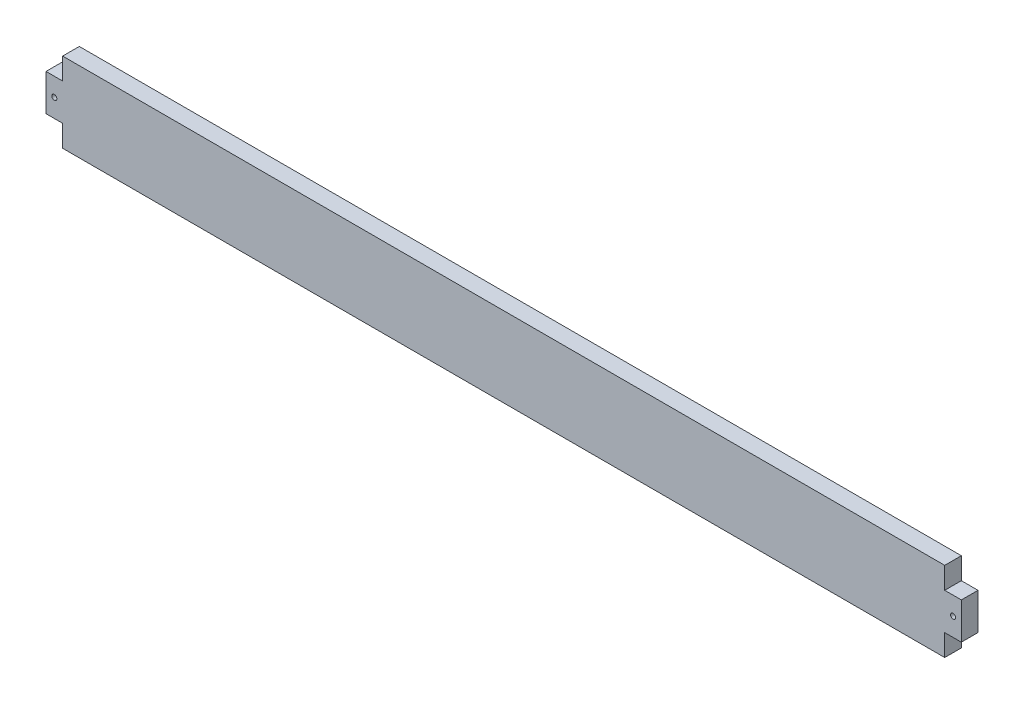
ISO-10303-21;
HEADER;
FILE_DESCRIPTION(('STEP AP214'),'2;1');
FILE_NAME('part.step','',(''),(''),'','','');
FILE_SCHEMA(('AUTOMOTIVE_DESIGN { 1 0 10303 214 1 1 1 1 }'));
ENDSEC;
DATA;
#1=APPLICATION_CONTEXT('core data for automotive mechanical design processes');
#2=APPLICATION_PROTOCOL_DEFINITION('international standard','automotive_design',2000,#1);
#3=PRODUCT_CONTEXT('',#1,'mechanical');
#4=PRODUCT('Part','Part','',(#3));
#5=PRODUCT_RELATED_PRODUCT_CATEGORY('part','',(#4));
#6=PRODUCT_DEFINITION_FORMATION('','',#4);
#7=PRODUCT_DEFINITION_CONTEXT('part definition',#1,'design');
#8=PRODUCT_DEFINITION('design','',#6,#7);
#9=PRODUCT_DEFINITION_SHAPE('','',#8);
#10=(LENGTH_UNIT() NAMED_UNIT(*) SI_UNIT(.MILLI.,.METRE.));
#11=(NAMED_UNIT(*) PLANE_ANGLE_UNIT() SI_UNIT($,.RADIAN.));
#12=(NAMED_UNIT(*) SI_UNIT($,.STERADIAN.) SOLID_ANGLE_UNIT());
#13=UNCERTAINTY_MEASURE_WITH_UNIT(LENGTH_MEASURE(1.E-05),#10,'distance_accuracy_value','');
#14=(GEOMETRIC_REPRESENTATION_CONTEXT(3) GLOBAL_UNCERTAINTY_ASSIGNED_CONTEXT((#13)) GLOBAL_UNIT_ASSIGNED_CONTEXT((#10,
#11,#12)) REPRESENTATION_CONTEXT('',''));
#15=CARTESIAN_POINT('',(0.,0.,0.));
#16=DIRECTION('',(0.,0.,1.));
#17=DIRECTION('',(1.,0.,0.));
#18=AXIS2_PLACEMENT_3D('',#15,#16,#17);
#19=CARTESIAN_POINT('',(275.,24.,10.));
#20=DIRECTION('',(-1.,0.,0.));
#21=DIRECTION('',(0.,-1.,0.));
#22=AXIS2_PLACEMENT_3D('',#19,#20,#21);
#23=PLANE('',#22);
#24=DIRECTION('',(0.,0.,1.));
#25=VECTOR('',#24,1.);
#26=CARTESIAN_POINT('',(275.,-11.,-0.000999999999999265));
#27=LINE('',#26,#25);
#28=CARTESIAN_POINT('',(275.,-11.,0.));
#29=VERTEX_POINT('',#28);
#30=CARTESIAN_POINT('',(275.,-11.,10.));
#31=VERTEX_POINT('',#30);
#32=EDGE_CURVE('E222',#29,#31,#27,.T.);
#33=ORIENTED_EDGE('',*,*,#32,.F.);
#34=DIRECTION('',(0.,1.,0.));
#35=VECTOR('',#34,1.);
#36=CARTESIAN_POINT('',(275.,24.,0.));
#37=LINE('',#36,#35);
#38=CARTESIAN_POINT('',(275.,11.,0.));
#39=VERTEX_POINT('',#38);
#40=EDGE_CURVE('E158',#29,#39,#37,.T.);
#41=ORIENTED_EDGE('',*,*,#40,.T.);
#42=DIRECTION('',(0.,0.,1.));
#43=VECTOR('',#42,1.);
#44=CARTESIAN_POINT('',(275.,11.,-0.000999999999999265));
#45=LINE('',#44,#43);
#46=CARTESIAN_POINT('',(275.,11.,10.));
#47=VERTEX_POINT('',#46);
#48=EDGE_CURVE('E142',#39,#47,#45,.T.);
#49=ORIENTED_EDGE('',*,*,#48,.T.);
#50=DIRECTION('',(0.,1.,0.));
#51=VECTOR('',#50,1.);
#52=CARTESIAN_POINT('',(275.,24.,10.));
#53=LINE('',#52,#51);
#54=EDGE_CURVE('E147',#31,#47,#53,.T.);
#55=ORIENTED_EDGE('',*,*,#54,.F.);
#56=EDGE_LOOP('',(#33,#41,#49,#55));
#57=FACE_BOUND('',#56,.T.);
#58=ADVANCED_FACE('F35',(#57),#23,.F.);
#59=CARTESIAN_POINT('',(-275.,24.,10.));
#60=DIRECTION('',(0.,-1.,0.));
#61=DIRECTION('',(0.,0.,-1.));
#62=AXIS2_PLACEMENT_3D('',#59,#60,#61);
#63=PLANE('',#62);
#64=DIRECTION('',(0.,0.,1.));
#65=VECTOR('',#64,1.);
#66=CARTESIAN_POINT('',(265.,24.,-0.000999999999999265));
#67=LINE('',#66,#65);
#68=CARTESIAN_POINT('',(265.,24.,0.));
#69=VERTEX_POINT('',#68);
#70=CARTESIAN_POINT('',(265.,24.,10.));
#71=VERTEX_POINT('',#70);
#72=EDGE_CURVE('E203',#69,#71,#67,.T.);
#73=ORIENTED_EDGE('',*,*,#72,.F.);
#74=DIRECTION('',(-1.,0.,0.));
#75=VECTOR('',#74,1.);
#76=CARTESIAN_POINT('',(-275.,24.,0.));
#77=LINE('',#76,#75);
#78=CARTESIAN_POINT('',(-265.,24.,0.));
#79=VERTEX_POINT('',#78);
#80=EDGE_CURVE('E153',#69,#79,#77,.T.);
#81=ORIENTED_EDGE('',*,*,#80,.T.);
#82=DIRECTION('',(0.,0.,1.));
#83=VECTOR('',#82,1.);
#84=CARTESIAN_POINT('',(-265.,24.,-0.000999999999999265));
#85=LINE('',#84,#83);
#86=CARTESIAN_POINT('',(-265.,24.,10.));
#87=VERTEX_POINT('',#86);
#88=EDGE_CURVE('E170',#79,#87,#85,.T.);
#89=ORIENTED_EDGE('',*,*,#88,.T.);
#90=DIRECTION('',(-1.,0.,0.));
#91=VECTOR('',#90,1.);
#92=CARTESIAN_POINT('',(-275.,24.,10.));
#93=LINE('',#92,#91);
#94=EDGE_CURVE('E150',#71,#87,#93,.T.);
#95=ORIENTED_EDGE('',*,*,#94,.F.);
#96=EDGE_LOOP('',(#73,#81,#89,#95));
#97=FACE_BOUND('',#96,.T.);
#98=ADVANCED_FACE('F269',(#97),#63,.F.);
#99=CARTESIAN_POINT('',(-275.,-24.,10.));
#100=DIRECTION('',(0.,1.,0.));
#101=DIRECTION('',(0.,0.,1.));
#102=AXIS2_PLACEMENT_3D('',#99,#100,#101);
#103=PLANE('',#102);
#104=DIRECTION('',(0.,0.,1.));
#105=VECTOR('',#104,1.);
#106=CARTESIAN_POINT('',(265.,-24.,-0.000999999999999265));
#107=LINE('',#106,#105);
#108=CARTESIAN_POINT('',(265.,-24.,0.));
#109=VERTEX_POINT('',#108);
#110=CARTESIAN_POINT('',(265.,-24.,10.));
#111=VERTEX_POINT('',#110);
#112=EDGE_CURVE('E124',#109,#111,#107,.T.);
#113=ORIENTED_EDGE('',*,*,#112,.T.);
#114=DIRECTION('',(1.,0.,0.));
#115=VECTOR('',#114,1.);
#116=CARTESIAN_POINT('',(-275.,-24.,10.));
#117=LINE('',#116,#115);
#118=CARTESIAN_POINT('',(-265.,-24.,10.));
#119=VERTEX_POINT('',#118);
#120=EDGE_CURVE('E11',#119,#111,#117,.T.);
#121=ORIENTED_EDGE('',*,*,#120,.F.);
#122=DIRECTION('',(0.,0.,1.));
#123=VECTOR('',#122,1.);
#124=CARTESIAN_POINT('',(-265.,-24.,-0.000999999999999265));
#125=LINE('',#124,#123);
#126=CARTESIAN_POINT('',(-265.,-24.,0.));
#127=VERTEX_POINT('',#126);
#128=EDGE_CURVE('E146',#127,#119,#125,.T.);
#129=ORIENTED_EDGE('',*,*,#128,.F.);
#130=DIRECTION('',(1.,0.,0.));
#131=VECTOR('',#130,1.);
#132=CARTESIAN_POINT('',(-275.,-24.,0.));
#133=LINE('',#132,#131);
#134=EDGE_CURVE('E38',#127,#109,#133,.T.);
#135=ORIENTED_EDGE('',*,*,#134,.T.);
#136=EDGE_LOOP('',(#113,#121,#129,#135));
#137=FACE_BOUND('',#136,.T.);
#138=ADVANCED_FACE('F145',(#137),#103,.F.);
#139=CARTESIAN_POINT('',(0.,0.,10.));
#140=DIRECTION('',(0.,0.,1.));
#141=DIRECTION('',(1.,0.,0.));
#142=AXIS2_PLACEMENT_3D('',#139,#140,#141);
#143=PLANE('',#142);
#144=CARTESIAN_POINT('',(270.,0.,10.));
#145=DIRECTION('',(0.,0.,-1.));
#146=DIRECTION('',(-1.,0.,0.));
#147=AXIS2_PLACEMENT_3D('',#144,#145,#146);
#148=CIRCLE('',#147,1.50000000000002);
#149=CARTESIAN_POINT('',(268.5,0.,10.));
#150=VERTEX_POINT('',#149);
#151=EDGE_CURVE('E220',#150,#150,#148,.T.);
#152=ORIENTED_EDGE('',*,*,#151,.T.);
#153=EDGE_LOOP('',(#152));
#154=FACE_BOUND('',#153,.T.);
#155=CARTESIAN_POINT('',(-270.,0.,10.));
#156=DIRECTION('',(0.,0.,1.));
#157=DIRECTION('',(1.,0.,0.));
#158=AXIS2_PLACEMENT_3D('',#155,#156,#157);
#159=CIRCLE('',#158,1.50000000000002);
#160=CARTESIAN_POINT('',(-268.5,0.,10.));
#161=VERTEX_POINT('',#160);
#162=EDGE_CURVE('E200',#161,#161,#159,.T.);
#163=ORIENTED_EDGE('',*,*,#162,.F.);
#164=EDGE_LOOP('',(#163));
#165=FACE_BOUND('',#164,.T.);
#166=ORIENTED_EDGE('',*,*,#120,.T.);
#167=DIRECTION('',(0.,1.,0.));
#168=VECTOR('',#167,1.);
#169=CARTESIAN_POINT('',(265.,-24.,10.));
#170=LINE('',#169,#168);
#171=CARTESIAN_POINT('',(265.,-11.,10.));
#172=VERTEX_POINT('',#171);
#173=EDGE_CURVE('E130',#111,#172,#170,.T.);
#174=ORIENTED_EDGE('',*,*,#173,.T.);
#175=DIRECTION('',(1.,0.,0.));
#176=VECTOR('',#175,1.);
#177=CARTESIAN_POINT('',(275.,-11.,10.));
#178=LINE('',#177,#176);
#179=EDGE_CURVE('E141',#172,#31,#178,.T.);
#180=ORIENTED_EDGE('',*,*,#179,.T.);
#181=ORIENTED_EDGE('',*,*,#54,.T.);
#182=DIRECTION('',(-1.,0.,0.));
#183=VECTOR('',#182,1.);
#184=CARTESIAN_POINT('',(265.,11.,10.));
#185=LINE('',#184,#183);
#186=CARTESIAN_POINT('',(265.,11.,10.));
#187=VERTEX_POINT('',#186);
#188=EDGE_CURVE('E205',#47,#187,#185,.T.);
#189=ORIENTED_EDGE('',*,*,#188,.T.);
#190=DIRECTION('',(0.,1.,0.));
#191=VECTOR('',#190,1.);
#192=CARTESIAN_POINT('',(265.,11.,10.));
#193=LINE('',#192,#191);
#194=EDGE_CURVE('E211',#187,#71,#193,.T.);
#195=ORIENTED_EDGE('',*,*,#194,.T.);
#196=ORIENTED_EDGE('',*,*,#94,.T.);
#197=DIRECTION('',(0.,1.,0.));
#198=VECTOR('',#197,1.);
#199=CARTESIAN_POINT('',(-265.,11.,10.));
#200=LINE('',#199,#198);
#201=CARTESIAN_POINT('',(-265.,11.,10.));
#202=VERTEX_POINT('',#201);
#203=EDGE_CURVE('E174',#202,#87,#200,.T.);
#204=ORIENTED_EDGE('',*,*,#203,.F.);
#205=DIRECTION('',(1.,0.,0.));
#206=VECTOR('',#205,1.);
#207=CARTESIAN_POINT('',(-265.,11.,10.));
#208=LINE('',#207,#206);
#209=CARTESIAN_POINT('',(-275.,11.,10.));
#210=VERTEX_POINT('',#209);
#211=EDGE_CURVE('E180',#210,#202,#208,.T.);
#212=ORIENTED_EDGE('',*,*,#211,.F.);
#213=DIRECTION('',(0.,-1.,0.));
#214=VECTOR('',#213,1.);
#215=CARTESIAN_POINT('',(-275.,24.,10.));
#216=LINE('',#215,#214);
#217=CARTESIAN_POINT('',(-275.,-11.,10.));
#218=VERTEX_POINT('',#217);
#219=EDGE_CURVE('E43',#210,#218,#216,.T.);
#220=ORIENTED_EDGE('',*,*,#219,.T.);
#221=DIRECTION('',(-1.,0.,0.));
#222=VECTOR('',#221,1.);
#223=CARTESIAN_POINT('',(-275.,-11.,10.));
#224=LINE('',#223,#222);
#225=CARTESIAN_POINT('',(-265.,-11.,10.));
#226=VERTEX_POINT('',#225);
#227=EDGE_CURVE('E188',#226,#218,#224,.T.);
#228=ORIENTED_EDGE('',*,*,#227,.F.);
#229=DIRECTION('',(0.,1.,0.));
#230=VECTOR('',#229,1.);
#231=CARTESIAN_POINT('',(-265.,-24.,10.));
#232=LINE('',#231,#230);
#233=EDGE_CURVE('E192',#119,#226,#232,.T.);
#234=ORIENTED_EDGE('',*,*,#233,.F.);
#235=EDGE_LOOP('',(#166,#174,#180,#181,#189,#195,#196,#204,#212,#220,#228,#234));
#236=FACE_BOUND('',#235,.T.);
#237=ADVANCED_FACE('F234',(#154,#165,#236),#143,.T.);
#238=CARTESIAN_POINT('',(0.,0.,0.));
#239=DIRECTION('',(0.,0.,1.));
#240=DIRECTION('',(1.,0.,0.));
#241=AXIS2_PLACEMENT_3D('',#238,#239,#240);
#242=PLANE('',#241);
#243=CARTESIAN_POINT('',(270.,0.,0.));
#244=DIRECTION('',(0.,0.,1.));
#245=DIRECTION('',(1.,0.,0.));
#246=AXIS2_PLACEMENT_3D('',#243,#244,#245);
#247=CIRCLE('',#246,1.50000000000002);
#248=CARTESIAN_POINT('',(271.5,0.,0.));
#249=VERTEX_POINT('',#248);
#250=EDGE_CURVE('E228',#249,#249,#247,.T.);
#251=ORIENTED_EDGE('',*,*,#250,.T.);
#252=EDGE_LOOP('',(#251));
#253=FACE_BOUND('',#252,.T.);
#254=CARTESIAN_POINT('',(-270.,0.,0.));
#255=DIRECTION('',(0.,0.,1.));
#256=DIRECTION('',(1.,0.,0.));
#257=AXIS2_PLACEMENT_3D('',#254,#255,#256);
#258=CIRCLE('',#257,1.50000000000002);
#259=CARTESIAN_POINT('',(-268.5,0.,0.));
#260=VERTEX_POINT('',#259);
#261=EDGE_CURVE('E185',#260,#260,#258,.F.);
#262=ORIENTED_EDGE('',*,*,#261,.F.);
#263=EDGE_LOOP('',(#262));
#264=FACE_BOUND('',#263,.T.);
#265=DIRECTION('',(0.,-1.,0.));
#266=VECTOR('',#265,1.);
#267=CARTESIAN_POINT('',(265.,-24.,0.));
#268=LINE('',#267,#266);
#269=CARTESIAN_POINT('',(265.,-11.,0.));
#270=VERTEX_POINT('',#269);
#271=EDGE_CURVE('E127',#270,#109,#268,.T.);
#272=ORIENTED_EDGE('',*,*,#271,.T.);
#273=ORIENTED_EDGE('',*,*,#134,.F.);
#274=DIRECTION('',(0.,-1.,0.));
#275=VECTOR('',#274,1.);
#276=CARTESIAN_POINT('',(-265.,-24.,0.));
#277=LINE('',#276,#275);
#278=CARTESIAN_POINT('',(-265.,-11.,0.));
#279=VERTEX_POINT('',#278);
#280=EDGE_CURVE('E169',#279,#127,#277,.T.);
#281=ORIENTED_EDGE('',*,*,#280,.F.);
#282=DIRECTION('',(1.,0.,0.));
#283=VECTOR('',#282,1.);
#284=CARTESIAN_POINT('',(-275.,-11.,0.));
#285=LINE('',#284,#283);
#286=CARTESIAN_POINT('',(-275.,-11.,0.));
#287=VERTEX_POINT('',#286);
#288=EDGE_CURVE('E195',#287,#279,#285,.T.);
#289=ORIENTED_EDGE('',*,*,#288,.F.);
#290=DIRECTION('',(0.,-1.,0.));
#291=VECTOR('',#290,1.);
#292=CARTESIAN_POINT('',(-275.,24.,0.));
#293=LINE('',#292,#291);
#294=CARTESIAN_POINT('',(-275.,11.,0.));
#295=VERTEX_POINT('',#294);
#296=EDGE_CURVE('E148',#295,#287,#293,.T.);
#297=ORIENTED_EDGE('',*,*,#296,.F.);
#298=DIRECTION('',(-1.,0.,0.));
#299=VECTOR('',#298,1.);
#300=CARTESIAN_POINT('',(-265.,11.,0.));
#301=LINE('',#300,#299);
#302=CARTESIAN_POINT('',(-265.,11.,0.));
#303=VERTEX_POINT('',#302);
#304=EDGE_CURVE('E167',#303,#295,#301,.T.);
#305=ORIENTED_EDGE('',*,*,#304,.F.);
#306=DIRECTION('',(0.,-1.,0.));
#307=VECTOR('',#306,1.);
#308=CARTESIAN_POINT('',(-265.,11.,0.));
#309=LINE('',#308,#307);
#310=EDGE_CURVE('E183',#79,#303,#309,.T.);
#311=ORIENTED_EDGE('',*,*,#310,.F.);
#312=ORIENTED_EDGE('',*,*,#80,.F.);
#313=DIRECTION('',(0.,-1.,0.));
#314=VECTOR('',#313,1.);
#315=CARTESIAN_POINT('',(265.,11.,0.));
#316=LINE('',#315,#314);
#317=CARTESIAN_POINT('',(265.,11.,0.));
#318=VERTEX_POINT('',#317);
#319=EDGE_CURVE('E217',#69,#318,#316,.T.);
#320=ORIENTED_EDGE('',*,*,#319,.T.);
#321=DIRECTION('',(1.,0.,0.));
#322=VECTOR('',#321,1.);
#323=CARTESIAN_POINT('',(265.,11.,0.));
#324=LINE('',#323,#322);
#325=EDGE_CURVE('E214',#318,#39,#324,.T.);
#326=ORIENTED_EDGE('',*,*,#325,.T.);
#327=ORIENTED_EDGE('',*,*,#40,.F.);
#328=DIRECTION('',(-1.,0.,0.));
#329=VECTOR('',#328,1.);
#330=CARTESIAN_POINT('',(275.,-11.,0.));
#331=LINE('',#330,#329);
#332=EDGE_CURVE('E134',#29,#270,#331,.T.);
#333=ORIENTED_EDGE('',*,*,#332,.T.);
#334=EDGE_LOOP('',(#272,#273,#281,#289,#297,#305,#311,#312,#320,#326,#327,#333));
#335=FACE_BOUND('',#334,.T.);
#336=ADVANCED_FACE('F138',(#253,#264,#335),#242,.F.);
#337=CARTESIAN_POINT('',(-275.,24.,10.));
#338=DIRECTION('',(1.,0.,0.));
#339=DIRECTION('',(0.,0.,-1.));
#340=AXIS2_PLACEMENT_3D('',#337,#338,#339);
#341=PLANE('',#340);
#342=ORIENTED_EDGE('',*,*,#296,.T.);
#343=DIRECTION('',(0.,0.,1.));
#344=VECTOR('',#343,1.);
#345=CARTESIAN_POINT('',(-275.,-11.,-0.000999999999999265));
#346=LINE('',#345,#344);
#347=EDGE_CURVE('E162',#287,#218,#346,.T.);
#348=ORIENTED_EDGE('',*,*,#347,.T.);
#349=ORIENTED_EDGE('',*,*,#219,.F.);
#350=DIRECTION('',(0.,0.,1.));
#351=VECTOR('',#350,1.);
#352=CARTESIAN_POINT('',(-275.,11.,-0.000999999999999265));
#353=LINE('',#352,#351);
#354=EDGE_CURVE('E171',#295,#210,#353,.T.);
#355=ORIENTED_EDGE('',*,*,#354,.F.);
#356=EDGE_LOOP('',(#342,#348,#349,#355));
#357=FACE_BOUND('',#356,.T.);
#358=ADVANCED_FACE('F246',(#357),#341,.F.);
#359=CARTESIAN_POINT('',(-265.,11.,-0.000999999999999265));
#360=DIRECTION('',(1.,0.,0.));
#361=DIRECTION('',(0.,1.,0.));
#362=AXIS2_PLACEMENT_3D('',#359,#360,#361);
#363=PLANE('',#362);
#364=ORIENTED_EDGE('',*,*,#310,.T.);
#365=DIRECTION('',(0.,0.,1.));
#366=VECTOR('',#365,1.);
#367=CARTESIAN_POINT('',(-265.,11.,-0.000999999999999265));
#368=LINE('',#367,#366);
#369=EDGE_CURVE('E173',#303,#202,#368,.T.);
#370=ORIENTED_EDGE('',*,*,#369,.T.);
#371=ORIENTED_EDGE('',*,*,#203,.T.);
#372=ORIENTED_EDGE('',*,*,#88,.F.);
#373=EDGE_LOOP('',(#364,#370,#371,#372));
#374=FACE_BOUND('',#373,.T.);
#375=ADVANCED_FACE('F294',(#374),#363,.F.);
#376=CARTESIAN_POINT('',(-265.,11.,-0.000999999999999265));
#377=DIRECTION('',(0.,-1.,0.));
#378=DIRECTION('',(1.,0.,0.));
#379=AXIS2_PLACEMENT_3D('',#376,#377,#378);
#380=PLANE('',#379);
#381=ORIENTED_EDGE('',*,*,#304,.T.);
#382=ORIENTED_EDGE('',*,*,#354,.T.);
#383=ORIENTED_EDGE('',*,*,#211,.T.);
#384=ORIENTED_EDGE('',*,*,#369,.F.);
#385=EDGE_LOOP('',(#381,#382,#383,#384));
#386=FACE_BOUND('',#385,.T.);
#387=ADVANCED_FACE('F299',(#386),#380,.F.);
#388=CARTESIAN_POINT('',(-275.,-11.,-0.000999999999999265));
#389=DIRECTION('',(0.,1.,0.));
#390=DIRECTION('',(0.,0.,1.));
#391=AXIS2_PLACEMENT_3D('',#388,#389,#390);
#392=PLANE('',#391);
#393=ORIENTED_EDGE('',*,*,#288,.T.);
#394=DIRECTION('',(0.,0.,1.));
#395=VECTOR('',#394,1.);
#396=CARTESIAN_POINT('',(-265.,-11.,-0.000999999999999265));
#397=LINE('',#396,#395);
#398=EDGE_CURVE('E187',#279,#226,#397,.T.);
#399=ORIENTED_EDGE('',*,*,#398,.T.);
#400=ORIENTED_EDGE('',*,*,#227,.T.);
#401=ORIENTED_EDGE('',*,*,#347,.F.);
#402=EDGE_LOOP('',(#393,#399,#400,#401));
#403=FACE_BOUND('',#402,.T.);
#404=ADVANCED_FACE('F263',(#403),#392,.F.);
#405=CARTESIAN_POINT('',(-265.,-24.,-0.000999999999999265));
#406=DIRECTION('',(1.,0.,0.));
#407=DIRECTION('',(0.,0.,-1.));
#408=AXIS2_PLACEMENT_3D('',#405,#406,#407);
#409=PLANE('',#408);
#410=ORIENTED_EDGE('',*,*,#280,.T.);
#411=ORIENTED_EDGE('',*,*,#128,.T.);
#412=ORIENTED_EDGE('',*,*,#233,.T.);
#413=ORIENTED_EDGE('',*,*,#398,.F.);
#414=EDGE_LOOP('',(#410,#411,#412,#413));
#415=FACE_BOUND('',#414,.T.);
#416=ADVANCED_FACE('F253',(#415),#409,.F.);
#417=CARTESIAN_POINT('',(-270.,0.,-0.000999999999999265));
#418=DIRECTION('',(0.,0.,1.));
#419=DIRECTION('',(1.,0.,0.));
#420=AXIS2_PLACEMENT_3D('',#417,#418,#419);
#421=CYLINDRICAL_SURFACE('',#420,1.50000000000002);
#422=ORIENTED_EDGE('',*,*,#162,.T.);
#423=EDGE_LOOP('',(#422));
#424=FACE_BOUND('',#423,.T.);
#425=ORIENTED_EDGE('',*,*,#261,.T.);
#426=EDGE_LOOP('',(#425));
#427=FACE_BOUND('',#426,.T.);
#428=ADVANCED_FACE('F250',(#424,#427),#421,.F.);
#429=CARTESIAN_POINT('',(265.,11.,-0.000999999999999265));
#430=DIRECTION('',(0.,1.,0.));
#431=DIRECTION('',(-1.,0.,0.));
#432=AXIS2_PLACEMENT_3D('',#429,#430,#431);
#433=PLANE('',#432);
#434=DIRECTION('',(0.,0.,1.));
#435=VECTOR('',#434,1.);
#436=CARTESIAN_POINT('',(265.,11.,-0.000999999999999265));
#437=LINE('',#436,#435);
#438=EDGE_CURVE('E59',#318,#187,#437,.T.);
#439=ORIENTED_EDGE('',*,*,#438,.T.);
#440=ORIENTED_EDGE('',*,*,#188,.F.);
#441=ORIENTED_EDGE('',*,*,#48,.F.);
#442=ORIENTED_EDGE('',*,*,#325,.F.);
#443=EDGE_LOOP('',(#439,#440,#441,#442));
#444=FACE_BOUND('',#443,.T.);
#445=ADVANCED_FACE('F252',(#444),#433,.T.);
#446=CARTESIAN_POINT('',(265.,11.,-0.000999999999999265));
#447=DIRECTION('',(1.,0.,0.));
#448=DIRECTION('',(0.,1.,0.));
#449=AXIS2_PLACEMENT_3D('',#446,#447,#448);
#450=PLANE('',#449);
#451=ORIENTED_EDGE('',*,*,#72,.T.);
#452=ORIENTED_EDGE('',*,*,#194,.F.);
#453=ORIENTED_EDGE('',*,*,#438,.F.);
#454=ORIENTED_EDGE('',*,*,#319,.F.);
#455=EDGE_LOOP('',(#451,#452,#453,#454));
#456=FACE_BOUND('',#455,.T.);
#457=ADVANCED_FACE('F260',(#456),#450,.T.);
#458=CARTESIAN_POINT('',(265.,-24.,-0.000999999999999265));
#459=DIRECTION('',(1.,0.,0.));
#460=DIRECTION('',(0.,0.,-1.));
#461=AXIS2_PLACEMENT_3D('',#458,#459,#460);
#462=PLANE('',#461);
#463=DIRECTION('',(0.,0.,1.));
#464=VECTOR('',#463,1.);
#465=CARTESIAN_POINT('',(265.,-11.,-0.000999999999999265));
#466=LINE('',#465,#464);
#467=EDGE_CURVE('E51',#270,#172,#466,.T.);
#468=ORIENTED_EDGE('',*,*,#467,.T.);
#469=ORIENTED_EDGE('',*,*,#173,.F.);
#470=ORIENTED_EDGE('',*,*,#112,.F.);
#471=ORIENTED_EDGE('',*,*,#271,.F.);
#472=EDGE_LOOP('',(#468,#469,#470,#471));
#473=FACE_BOUND('',#472,.T.);
#474=ADVANCED_FACE('F126',(#473),#462,.T.);
#475=CARTESIAN_POINT('',(275.,-11.,-0.000999999999999265));
#476=DIRECTION('',(0.,-1.,0.));
#477=DIRECTION('',(0.,0.,-1.));
#478=AXIS2_PLACEMENT_3D('',#475,#476,#477);
#479=PLANE('',#478);
#480=ORIENTED_EDGE('',*,*,#32,.T.);
#481=ORIENTED_EDGE('',*,*,#179,.F.);
#482=ORIENTED_EDGE('',*,*,#467,.F.);
#483=ORIENTED_EDGE('',*,*,#332,.F.);
#484=EDGE_LOOP('',(#480,#481,#482,#483));
#485=FACE_BOUND('',#484,.T.);
#486=ADVANCED_FACE('F240',(#485),#479,.T.);
#487=CARTESIAN_POINT('',(270.,0.,-0.000999999999999265));
#488=DIRECTION('',(0.,0.,1.));
#489=DIRECTION('',(1.,0.,0.));
#490=AXIS2_PLACEMENT_3D('',#487,#488,#489);
#491=CYLINDRICAL_SURFACE('',#490,1.50000000000002);
#492=ORIENTED_EDGE('',*,*,#151,.F.);
#493=EDGE_LOOP('',(#492));
#494=FACE_BOUND('',#493,.T.);
#495=ORIENTED_EDGE('',*,*,#250,.F.);
#496=EDGE_LOOP('',(#495));
#497=FACE_BOUND('',#496,.T.);
#498=ADVANCED_FACE('F237',(#494,#497),#491,.F.);
#499=CLOSED_SHELL('',(#58,#98,#138,#237,#336,#358,#375,#387,#404,#416,#428,#445,#457,#474,#486,#498));
#500=MANIFOLD_SOLID_BREP('B2',#499);
#501=ADVANCED_BREP_SHAPE_REPRESENTATION('',(#18,#500),#14);
#502=SHAPE_DEFINITION_REPRESENTATION(#9,#501);
ENDSEC;
END-ISO-10303-21;
